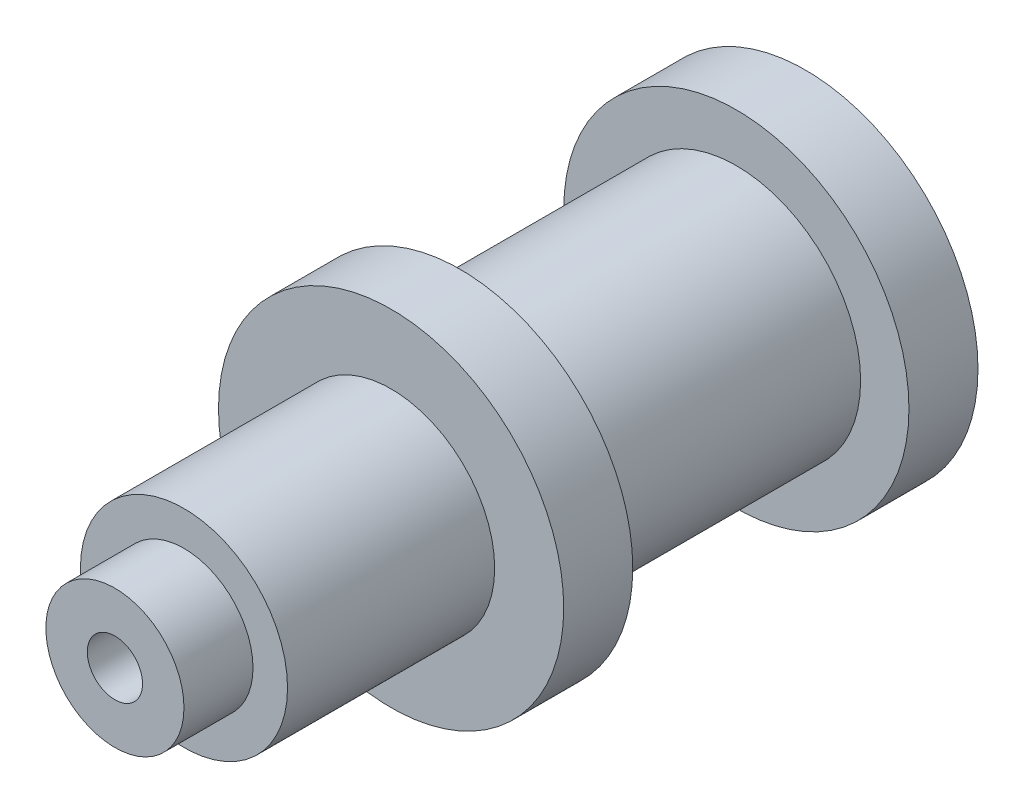
ISO-10303-21;
HEADER;
FILE_DESCRIPTION(('STEP AP214'),'2;1');
FILE_NAME('part.step','',(''),(''),'','','');
FILE_SCHEMA(('AUTOMOTIVE_DESIGN { 1 0 10303 214 1 1 1 1 }'));
ENDSEC;
DATA;
#1=APPLICATION_CONTEXT('core data for automotive mechanical design processes');
#2=APPLICATION_PROTOCOL_DEFINITION('international standard','automotive_design',2000,#1);
#3=PRODUCT_CONTEXT('',#1,'mechanical');
#4=PRODUCT('Part','Part','',(#3));
#5=PRODUCT_RELATED_PRODUCT_CATEGORY('part','',(#4));
#6=PRODUCT_DEFINITION_FORMATION('','',#4);
#7=PRODUCT_DEFINITION_CONTEXT('part definition',#1,'design');
#8=PRODUCT_DEFINITION('design','',#6,#7);
#9=PRODUCT_DEFINITION_SHAPE('','',#8);
#10=(LENGTH_UNIT() NAMED_UNIT(*) SI_UNIT(.MILLI.,.METRE.));
#11=(NAMED_UNIT(*) PLANE_ANGLE_UNIT() SI_UNIT($,.RADIAN.));
#12=(NAMED_UNIT(*) SI_UNIT($,.STERADIAN.) SOLID_ANGLE_UNIT());
#13=UNCERTAINTY_MEASURE_WITH_UNIT(LENGTH_MEASURE(1.E-05),#10,'distance_accuracy_value','');
#14=(GEOMETRIC_REPRESENTATION_CONTEXT(3) GLOBAL_UNCERTAINTY_ASSIGNED_CONTEXT((#13)) GLOBAL_UNIT_ASSIGNED_CONTEXT((#10,
#11,#12)) REPRESENTATION_CONTEXT('',''));
#15=CARTESIAN_POINT('',(0.,0.,0.));
#16=DIRECTION('',(0.,0.,1.));
#17=DIRECTION('',(1.,0.,0.));
#18=AXIS2_PLACEMENT_3D('',#15,#16,#17);
#19=CARTESIAN_POINT('',(0.,0.,60.));
#20=DIRECTION('',(0.,0.,1.));
#21=DIRECTION('',(1.,0.,0.));
#22=AXIS2_PLACEMENT_3D('',#19,#20,#21);
#23=PLANE('',#22);
#24=CARTESIAN_POINT('',(0.,0.,60.));
#25=DIRECTION('',(0.,0.,1.));
#26=DIRECTION('',(1.,0.,0.));
#27=AXIS2_PLACEMENT_3D('',#24,#25,#26);
#28=CIRCLE('',#27,15.);
#29=CARTESIAN_POINT('',(15.,0.,60.));
#30=VERTEX_POINT('',#29);
#31=EDGE_CURVE('E25',#30,#30,#28,.T.);
#32=ORIENTED_EDGE('',*,*,#31,.F.);
#33=EDGE_LOOP('',(#32));
#34=FACE_BOUND('',#33,.T.);
#35=CARTESIAN_POINT('',(0.,0.,60.));
#36=DIRECTION('',(0.,0.,1.));
#37=DIRECTION('',(1.,0.,0.));
#38=AXIS2_PLACEMENT_3D('',#35,#36,#37);
#39=CIRCLE('',#38,25.);
#40=CARTESIAN_POINT('',(25.,0.,60.));
#41=VERTEX_POINT('',#40);
#42=EDGE_CURVE('E45',#41,#41,#39,.T.);
#43=ORIENTED_EDGE('',*,*,#42,.T.);
#44=EDGE_LOOP('',(#43));
#45=FACE_BOUND('',#44,.T.);
#46=ADVANCED_FACE('F16',(#34,#45),#23,.T.);
#47=CARTESIAN_POINT('',(0.,0.,60.));
#48=DIRECTION('',(0.,0.,1.));
#49=DIRECTION('',(1.,0.,0.));
#50=AXIS2_PLACEMENT_3D('',#47,#48,#49);
#51=CYLINDRICAL_SURFACE('',#50,15.);
#52=ORIENTED_EDGE('',*,*,#31,.T.);
#53=DIRECTION('',(0.,0.,1.));
#54=VECTOR('',#53,1.);
#55=CARTESIAN_POINT('',(15.,0.,60.));
#56=LINE('',#55,#54);
#57=CARTESIAN_POINT('',(15.,0.,90.));
#58=VERTEX_POINT('',#57);
#59=EDGE_CURVE('E10',#30,#58,#56,.T.);
#60=ORIENTED_EDGE('',*,*,#59,.T.);
#61=CARTESIAN_POINT('',(0.,0.,90.));
#62=DIRECTION('',(0.,0.,1.));
#63=DIRECTION('',(1.,0.,0.));
#64=AXIS2_PLACEMENT_3D('',#61,#62,#63);
#65=CIRCLE('',#64,15.);
#66=EDGE_CURVE('E256',#58,#58,#65,.T.);
#67=ORIENTED_EDGE('',*,*,#66,.F.);
#68=ORIENTED_EDGE('',*,*,#59,.F.);
#69=EDGE_LOOP('',(#52,#60,#67,#68));
#70=FACE_BOUND('',#69,.T.);
#71=ADVANCED_FACE('F18',(#70),#51,.T.);
#72=CARTESIAN_POINT('',(0.,0.,50.));
#73=DIRECTION('',(0.,0.,1.));
#74=DIRECTION('',(1.,0.,0.));
#75=AXIS2_PLACEMENT_3D('',#72,#73,#74);
#76=CYLINDRICAL_SURFACE('',#75,25.);
#77=CARTESIAN_POINT('',(0.,0.,50.));
#78=DIRECTION('',(0.,0.,1.));
#79=DIRECTION('',(1.,0.,0.));
#80=AXIS2_PLACEMENT_3D('',#77,#78,#79);
#81=CIRCLE('',#80,25.);
#82=CARTESIAN_POINT('',(25.,0.,50.));
#83=VERTEX_POINT('',#82);
#84=EDGE_CURVE('E253',#83,#83,#81,.T.);
#85=ORIENTED_EDGE('',*,*,#84,.T.);
#86=DIRECTION('',(0.,0.,1.));
#87=VECTOR('',#86,1.);
#88=CARTESIAN_POINT('',(25.,0.,50.));
#89=LINE('',#88,#87);
#90=EDGE_CURVE('E92',#83,#41,#89,.T.);
#91=ORIENTED_EDGE('',*,*,#90,.T.);
#92=ORIENTED_EDGE('',*,*,#42,.F.);
#93=ORIENTED_EDGE('',*,*,#90,.F.);
#94=EDGE_LOOP('',(#85,#91,#92,#93));
#95=FACE_BOUND('',#94,.T.);
#96=ADVANCED_FACE('F271',(#95),#76,.T.);
#97=CARTESIAN_POINT('',(0.,0.,90.));
#98=DIRECTION('',(0.,0.,1.));
#99=DIRECTION('',(1.,0.,0.));
#100=AXIS2_PLACEMENT_3D('',#97,#98,#99);
#101=PLANE('',#100);
#102=CARTESIAN_POINT('',(0.,0.,90.));
#103=DIRECTION('',(0.,0.,1.));
#104=DIRECTION('',(1.,0.,0.));
#105=AXIS2_PLACEMENT_3D('',#102,#103,#104);
#106=CIRCLE('',#105,10.);
#107=CARTESIAN_POINT('',(10.,0.,90.));
#108=VERTEX_POINT('',#107);
#109=EDGE_CURVE('E246',#108,#108,#106,.T.);
#110=ORIENTED_EDGE('',*,*,#109,.F.);
#111=EDGE_LOOP('',(#110));
#112=FACE_BOUND('',#111,.T.);
#113=ORIENTED_EDGE('',*,*,#66,.T.);
#114=EDGE_LOOP('',(#113));
#115=FACE_BOUND('',#114,.T.);
#116=ADVANCED_FACE('F276',(#112,#115),#101,.T.);
#117=CARTESIAN_POINT('',(0.,0.,50.));
#118=DIRECTION('',(0.,0.,1.));
#119=DIRECTION('',(1.,0.,0.));
#120=AXIS2_PLACEMENT_3D('',#117,#118,#119);
#121=PLANE('',#120);
#122=ORIENTED_EDGE('',*,*,#84,.F.);
#123=EDGE_LOOP('',(#122));
#124=FACE_BOUND('',#123,.T.);
#125=CARTESIAN_POINT('',(0.,0.,50.));
#126=DIRECTION('',(0.,0.,1.));
#127=DIRECTION('',(1.,0.,0.));
#128=AXIS2_PLACEMENT_3D('',#125,#126,#127);
#129=CIRCLE('',#128,18.);
#130=CARTESIAN_POINT('',(18.,0.,50.));
#131=VERTEX_POINT('',#130);
#132=EDGE_CURVE('E240',#131,#131,#129,.T.);
#133=ORIENTED_EDGE('',*,*,#132,.T.);
#134=EDGE_LOOP('',(#133));
#135=FACE_BOUND('',#134,.T.);
#136=ADVANCED_FACE('F279',(#124,#135),#121,.F.);
#137=CARTESIAN_POINT('',(0.,0.,90.));
#138=DIRECTION('',(0.,0.,1.));
#139=DIRECTION('',(1.,0.,0.));
#140=AXIS2_PLACEMENT_3D('',#137,#138,#139);
#141=CYLINDRICAL_SURFACE('',#140,10.);
#142=ORIENTED_EDGE('',*,*,#109,.T.);
#143=DIRECTION('',(0.,0.,1.));
#144=VECTOR('',#143,1.);
#145=CARTESIAN_POINT('',(10.,0.,90.));
#146=LINE('',#145,#144);
#147=CARTESIAN_POINT('',(10.,0.,100.));
#148=VERTEX_POINT('',#147);
#149=EDGE_CURVE('E82',#108,#148,#146,.T.);
#150=ORIENTED_EDGE('',*,*,#149,.T.);
#151=CARTESIAN_POINT('',(0.,0.,100.));
#152=DIRECTION('',(0.,0.,1.));
#153=DIRECTION('',(1.,0.,0.));
#154=AXIS2_PLACEMENT_3D('',#151,#152,#153);
#155=CIRCLE('',#154,10.);
#156=EDGE_CURVE('E232',#148,#148,#155,.T.);
#157=ORIENTED_EDGE('',*,*,#156,.F.);
#158=ORIENTED_EDGE('',*,*,#149,.F.);
#159=EDGE_LOOP('',(#142,#150,#157,#158));
#160=FACE_BOUND('',#159,.T.);
#161=ADVANCED_FACE('F274',(#160),#141,.T.);
#162=CARTESIAN_POINT('',(0.,0.,10.));
#163=DIRECTION('',(0.,0.,1.));
#164=DIRECTION('',(1.,0.,0.));
#165=AXIS2_PLACEMENT_3D('',#162,#163,#164);
#166=CYLINDRICAL_SURFACE('',#165,18.);
#167=CARTESIAN_POINT('',(0.,0.,10.));
#168=DIRECTION('',(0.,0.,1.));
#169=DIRECTION('',(1.,0.,0.));
#170=AXIS2_PLACEMENT_3D('',#167,#168,#169);
#171=CIRCLE('',#170,18.);
#172=CARTESIAN_POINT('',(18.,0.,10.));
#173=VERTEX_POINT('',#172);
#174=EDGE_CURVE('E134',#173,#173,#171,.T.);
#175=ORIENTED_EDGE('',*,*,#174,.T.);
#176=DIRECTION('',(0.,0.,1.));
#177=VECTOR('',#176,1.);
#178=CARTESIAN_POINT('',(18.,0.,10.));
#179=LINE('',#178,#177);
#180=EDGE_CURVE('E233',#173,#131,#179,.T.);
#181=ORIENTED_EDGE('',*,*,#180,.T.);
#182=ORIENTED_EDGE('',*,*,#132,.F.);
#183=ORIENTED_EDGE('',*,*,#180,.F.);
#184=EDGE_LOOP('',(#175,#181,#182,#183));
#185=FACE_BOUND('',#184,.T.);
#186=ADVANCED_FACE('F290',(#185),#166,.T.);
#187=CARTESIAN_POINT('',(0.,0.,100.));
#188=DIRECTION('',(0.,0.,1.));
#189=DIRECTION('',(1.,0.,0.));
#190=AXIS2_PLACEMENT_3D('',#187,#188,#189);
#191=PLANE('',#190);
#192=CARTESIAN_POINT('',(0.,0.,100.));
#193=DIRECTION('',(0.,0.,-1.));
#194=DIRECTION('',(1.,0.,0.));
#195=AXIS2_PLACEMENT_3D('',#192,#193,#194);
#196=CIRCLE('',#195,4.);
#197=CARTESIAN_POINT('',(4.,0.,100.));
#198=VERTEX_POINT('',#197);
#199=EDGE_CURVE('E152',#198,#198,#196,.T.);
#200=ORIENTED_EDGE('',*,*,#199,.T.);
#201=EDGE_LOOP('',(#200));
#202=FACE_BOUND('',#201,.T.);
#203=ORIENTED_EDGE('',*,*,#156,.T.);
#204=EDGE_LOOP('',(#203));
#205=FACE_BOUND('',#204,.T.);
#206=ADVANCED_FACE('F329',(#202,#205),#191,.T.);
#207=CARTESIAN_POINT('',(1.299,0.,0.375));
#208=CARTESIAN_POINT('',(2.892931773095,0.411152599877,0.3957306991));
#209=CARTESIAN_POINT('',(4.339051681888,1.932754386365,0.448105189563));
#210=CARTESIAN_POINT('',(4.998874652403,4.507757380223,0.531340942699));
#211=CARTESIAN_POINT('',(4.212212200387,7.692851955475,0.647635530179));
#212=CARTESIAN_POINT('',(1.681336378804,10.654971548693,0.79246728603));
#213=CARTESIAN_POINT('',(-2.475743037412,12.40267789219,0.972785491627));
#214=CARTESIAN_POINT('',(-7.416902117072,12.159300956611,1.180541544115));
#215=CARTESIAN_POINT('',(-12.1293018314,9.721468491896,1.422398424597));
#216=CARTESIAN_POINT('',(-15.60111036593,5.436976685875,1.694225449425));
#217=CARTESIAN_POINT('',(-18.7869980561,-5.341230633489,2.300922790337));
#218=CARTESIAN_POINT('',(-18.49621449088,-11.83572343247,2.635088989959));
#219=CARTESIAN_POINT('',(-15.68307156637,-18.69218789534,3.00129012374));
#220=CARTESIAN_POINT('',(-10.00475141449,-24.7896862544,3.397099713738));
#221=CARTESIAN_POINT('',(-1.782733150204,-28.77049148836,3.823895023192));
#222=CARTESIAN_POINT('',(8.041762442298,-29.47028661474,4.283781743196));
#223=CARTESIAN_POINT('',(17.813642650211,-26.31501145167,4.769354402122));
#224=CARTESIAN_POINT('',(25.929757724233,-19.64853201211,5.290138851515));
#225=CARTESIAN_POINT('',(31.09122090286,-10.48873805591,5.837697179465));
#226=CARTESIAN_POINT('',(32.682257866012,-0.249232711201,6.416501843755));
#227=CARTESIAN_POINT('',(-1.299,0.,0.375));
#228=CARTESIAN_POINT('',(0.29493177309,-0.402476515756,0.349526654312));
#229=CARTESIAN_POINT('',(2.025085191258,0.305339224308,0.355822128066));
#230=CARTESIAN_POINT('',(3.253063542986,2.179032461829,0.392723195656));
#231=CARTESIAN_POINT('',(3.267861402046,4.885378102018,0.463074993671));
#232=CARTESIAN_POINT('',(1.671150460134,7.679724856956,0.56182316367));
#233=CARTESIAN_POINT('',(-1.554445644197,9.598304554313,0.6959968613));
#234=CARTESIAN_POINT('',(-5.700090057267,9.833240780175,0.858115058896));
#235=CARTESIAN_POINT('',(-9.851382343361,8.091666229255,1.054052284863));
#236=CARTESIAN_POINT('',(-13.04389531889,4.610982070437,1.280326793184));
#237=CARTESIAN_POINT('',(-16.23032704606,-4.565654436154,1.796103111966));
#238=CARTESIAN_POINT('',(-16.21935636797,-10.26222932034,2.085040983632));
#239=CARTESIAN_POINT('',(-13.9633831341,-16.43420765637,2.405969576249));
#240=CARTESIAN_POINT('',(-9.06732058999,-22.06801820513,2.757118603172));
#241=CARTESIAN_POINT('',(-1.752347185475,-25.88929128016,3.139052836625));
#242=CARTESIAN_POINT('',(7.172514142269,-26.75746897833,3.554493181527));
#243=CARTESIAN_POINT('',(16.180145989125,-24.06533286364,3.996044952312));
#244=CARTESIAN_POINT('',(23.759869637071,-18.06775434624,4.472769986635));
#245=CARTESIAN_POINT('',(28.655602896442,-9.676510676631,4.976825060867));
#246=CARTESIAN_POINT('',(30.247178383028,-0.199612630426,5.512328321065));
#247=(BOUNDED_SURFACE() B_SPLINE_SURFACE(1,10,((#207,#208,#209,#210,#211,#212,#213,#214,#215,
#216,#217,#218,#219,#220,#221,#222,#223,#224,#225,#226),(#227,#228,#229,#230,#231,#232,#233,
#234,#235,#236,#237,#238,#239,#240,#241,#242,#243,#244,#245,#246)),.UNSPECIFIED.,.F.,.F.,
.F.) B_SPLINE_SURFACE_WITH_KNOTS((2,2),(11,9,11),(0.,2.598),(0.,0.5,1.),
.UNSPECIFIED.) GEOMETRIC_REPRESENTATION_ITEM() RATIONAL_B_SPLINE_SURFACE(((1.,1.,1.,1.,1.,1.,1.,
1.,1.,1.,1.,1.,1.,1.,1.,1.,1.,1.,1.,1.),(1.,1.,1.,1.,1.,1.,1.,1.,1.,1.,1.,1.,1.,1.,1.,1.,1.,1.,
1.,1.))) REPRESENTATION_ITEM('') SURFACE());
#248=CARTESIAN_POINT('',(1.299,0.,0.375));
#249=CARTESIAN_POINT('',(2.892931773095,0.411152599877,0.3957306991));
#250=CARTESIAN_POINT('',(4.339051681888,1.932754386365,0.448105189563));
#251=CARTESIAN_POINT('',(4.998874652403,4.507757380223,0.531340942699));
#252=CARTESIAN_POINT('',(4.212212200387,7.692851955475,0.647635530179));
#253=CARTESIAN_POINT('',(1.681336378804,10.654971548693,0.79246728603));
#254=CARTESIAN_POINT('',(-2.475743037412,12.40267789219,0.972785491627));
#255=CARTESIAN_POINT('',(-7.416902117072,12.159300956611,1.180541544115));
#256=CARTESIAN_POINT('',(-12.1293018314,9.721468491896,1.422398424597));
#257=CARTESIAN_POINT('',(-15.60111036593,5.436976685875,1.694225449425));
#258=CARTESIAN_POINT('',(-18.7869980561,-5.341230633489,2.300922790337));
#259=CARTESIAN_POINT('',(-18.49621449088,-11.83572343247,2.635088989959));
#260=CARTESIAN_POINT('',(-15.68307156637,-18.69218789534,3.00129012374));
#261=CARTESIAN_POINT('',(-10.00475141449,-24.7896862544,3.397099713738));
#262=CARTESIAN_POINT('',(-1.782733150204,-28.77049148836,3.823895023192));
#263=CARTESIAN_POINT('',(8.041762442298,-29.47028661474,4.283781743196));
#264=CARTESIAN_POINT('',(17.813642650211,-26.31501145167,4.769354402122));
#265=CARTESIAN_POINT('',(25.929757724233,-19.64853201211,5.290138851515));
#266=CARTESIAN_POINT('',(31.09122090286,-10.48873805591,5.837697179465));
#267=CARTESIAN_POINT('',(32.682257866012,-0.249232711201,6.416501843755));
#268=(BOUNDED_CURVE() B_SPLINE_CURVE(10,(#248,#249,#250,#251,#252,#253,#254,#255,#256,#257,#258,
#259,#260,#261,#262,#263,#264,#265,#266,#267),.UNSPECIFIED.,.F.,
.F.) B_SPLINE_CURVE_WITH_KNOTS((11,9,11),(0.,0.5,1.),
.UNSPECIFIED.) CURVE() GEOMETRIC_REPRESENTATION_ITEM() RATIONAL_B_SPLINE_CURVE((1.,1.,1.,1.,1.,
1.,1.,1.,1.,1.,1.,1.,1.,1.,1.,1.,1.,1.,1.,1.)) REPRESENTATION_ITEM(''));
#269=CARTESIAN_POINT('',(3.444794751082,2.033073811478,0.450868597613));
#270=VERTEX_POINT('',#269);
#271=CARTESIAN_POINT('',(-0.234510128568,-24.99890007579,3.856892967297));
#272=VERTEX_POINT('',#271);
#273=EDGE_CURVE('E107',#270,#272,#268,.T.);
#274=CARTESIAN_POINT('',(2.003777417636,3.46191797427,0.44696259329));
#275=CARTESIAN_POINT('',(2.114705908061,3.39771194578,0.449561716193));
#276=CARTESIAN_POINT('',(2.222905434678,3.328758501729,0.451768600507));
#277=CARTESIAN_POINT('',(2.328067848059,3.255232405279,0.453583100443));
#278=CARTESIAN_POINT('',(2.531756474952,3.099459369269,0.456427216072));
#279=CARTESIAN_POINT('',(2.63028262451,3.017211933922,0.457456800779));
#280=CARTESIAN_POINT('',(2.72520555052,2.930819005488,0.45809379778));
#281=CARTESIAN_POINT('',(2.907344765829,2.750235204238,0.458582573346));
#282=CARTESIAN_POINT('',(2.994560781069,2.656043696785,0.458434305625));
#283=CARTESIAN_POINT('',(3.077667767394,2.558204493077,0.457893346206));
#284=CARTESIAN_POINT('',(3.235234109731,2.35578267519,0.456026009212));
#285=CARTESIAN_POINT('',(3.309692918545,2.251199322691,0.454699568038));
#286=CARTESIAN_POINT('',(3.379606260899,2.143527729848,0.452980410684));
#287=CARTESIAN_POINT('',(3.444794751082,2.033073811478,0.450868597613));
#288=(BOUNDED_CURVE() B_SPLINE_CURVE(4,(#274,#275,#276,#277,#278,#279,#280,#281,#282,#283,#284,
#285,#286,#287),.UNSPECIFIED.,.F.,.F.) B_SPLINE_CURVE_WITH_KNOTS((5,3,3,3,5),(0.,0.249980157508,
0.499970296045,0.749975107285,1.),
.UNSPECIFIED.) CURVE() GEOMETRIC_REPRESENTATION_ITEM() RATIONAL_B_SPLINE_CURVE((1.,1.,1.,1.,1.,
1.,1.,1.,1.,1.,1.,1.,1.,1.)) REPRESENTATION_ITEM(''));
#289=CARTESIAN_POINT('',(2.003777417636,3.46191797427,0.44696259329));
#290=VERTEX_POINT('',#289);
#291=EDGE_CURVE('E146',#290,#270,#288,.T.);
#292=CARTESIAN_POINT('',(-1.299,0.,0.375));
#293=CARTESIAN_POINT('',(0.29493177309,-0.402476515756,0.349526654312));
#294=CARTESIAN_POINT('',(2.025085191258,0.305339224308,0.355822128066));
#295=CARTESIAN_POINT('',(3.253063542986,2.179032461829,0.392723195656));
#296=CARTESIAN_POINT('',(3.267861402046,4.885378102018,0.463074993671));
#297=CARTESIAN_POINT('',(1.671150460134,7.679724856956,0.56182316367));
#298=CARTESIAN_POINT('',(-1.554445644197,9.598304554313,0.6959968613));
#299=CARTESIAN_POINT('',(-5.700090057267,9.833240780175,0.858115058896));
#300=CARTESIAN_POINT('',(-9.851382343361,8.091666229255,1.054052284863));
#301=CARTESIAN_POINT('',(-13.04389531889,4.610982070437,1.280326793184));
#302=CARTESIAN_POINT('',(-16.23032704606,-4.565654436154,1.796103111966));
#303=CARTESIAN_POINT('',(-16.21935636797,-10.26222932034,2.085040983632));
#304=CARTESIAN_POINT('',(-13.9633831341,-16.43420765637,2.405969576249));
#305=CARTESIAN_POINT('',(-9.06732058999,-22.06801820513,2.757118603172));
#306=CARTESIAN_POINT('',(-1.752347185475,-25.88929128016,3.139052836625));
#307=CARTESIAN_POINT('',(7.172514142269,-26.75746897833,3.554493181527));
#308=CARTESIAN_POINT('',(16.180145989125,-24.06533286364,3.996044952312));
#309=CARTESIAN_POINT('',(23.759869637071,-18.06775434624,4.472769986635));
#310=CARTESIAN_POINT('',(28.655602896442,-9.676510676631,4.976825060867));
#311=CARTESIAN_POINT('',(30.247178383028,-0.199612630426,5.512328321065));
#312=(BOUNDED_CURVE() B_SPLINE_CURVE(10,(#292,#293,#294,#295,#296,#297,#298,#299,#300,#301,#302,
#303,#304,#305,#306,#307,#308,#309,#310,#311),.UNSPECIFIED.,.F.,
.F.) B_SPLINE_CURVE_WITH_KNOTS((11,9,11),(0.,0.5,1.),
.UNSPECIFIED.) CURVE() GEOMETRIC_REPRESENTATION_ITEM() RATIONAL_B_SPLINE_CURVE((1.,1.,1.,1.,1.,
1.,1.,1.,1.,1.,1.,1.,1.,1.,1.,1.,1.,1.,1.,1.)) REPRESENTATION_ITEM(''));
#313=CARTESIAN_POINT('',(11.901133517175,-21.98551843842,3.848086116951));
#314=VERTEX_POINT('',#313);
#315=EDGE_CURVE('E139',#290,#314,#312,.T.);
#316=CARTESIAN_POINT('',(11.901133517175,-21.98551843842,3.848086116951));
#317=CARTESIAN_POINT('',(11.208992277155,-22.360186215,3.851085725068));
#318=CARTESIAN_POINT('',(10.501096782861,-22.70581574115,3.853674891557));
#319=CARTESIAN_POINT('',(9.779277905743,-23.02140951542,3.855854890986));
#320=CARTESIAN_POINT('',(8.309963357747,-23.59167184479,3.859403137382));
#321=CARTESIAN_POINT('',(7.562410092294,-23.84619691162,3.860769478748));
#322=CARTESIAN_POINT('',(6.804774304263,-24.06901834865,3.861727197245));
#323=CARTESIAN_POINT('',(5.271693827403,-24.45065725416,3.862829096867));
#324=CARTESIAN_POINT('',(4.496211360675,-24.60933033366,3.862971448026));
#325=CARTESIAN_POINT('',(3.714697378013,-24.73512754509,3.862705829943));
#326=CARTESIAN_POINT('',(2.142118027352,-24.92066482801,3.861359762147));
#327=CARTESIAN_POINT('',(1.351034053811,-24.98026243438,3.860277559636));
#328=CARTESIAN_POINT('',(0.558114724247,-25.00633554517,3.85878819821));
#329=CARTESIAN_POINT('',(-0.234510128568,-24.99890007579,3.856892967297));
#330=(BOUNDED_CURVE() B_SPLINE_CURVE(4,(#316,#317,#318,#319,#320,#321,#322,#323,#324,#325,#326,
#327,#328,#329),.UNSPECIFIED.,.F.,.F.) B_SPLINE_CURVE_WITH_KNOTS((5,3,3,3,5),(0.,0.24914845112,
0.498879109945,0.74917036796,1.),
.UNSPECIFIED.) CURVE() GEOMETRIC_REPRESENTATION_ITEM() RATIONAL_B_SPLINE_CURVE((1.,1.,1.,1.,1.,
1.,1.,1.,1.,1.,1.,1.,1.,1.)) REPRESENTATION_ITEM(''));
#331=EDGE_CURVE('E173',#314,#272,#330,.T.);
#332=ORIENTED_EDGE('',*,*,#273,.F.);
#333=ORIENTED_EDGE('',*,*,#291,.F.);
#334=ORIENTED_EDGE('',*,*,#315,.T.);
#335=ORIENTED_EDGE('',*,*,#331,.T.);
#336=EDGE_LOOP('',(#332,#333,#334,#335));
#337=FACE_BOUND('',#336,.T.);
#338=ADVANCED_FACE('F312',(#337),#247,.T.);
#339=CARTESIAN_POINT('',(-1.299,0.,0.375));
#340=CARTESIAN_POINT('',(0.29493177309,-0.402476515756,0.349526654312));
#341=CARTESIAN_POINT('',(2.025085191258,0.305339224308,0.355822128066));
#342=CARTESIAN_POINT('',(3.253063542986,2.179032461829,0.392723195656));
#343=CARTESIAN_POINT('',(3.267861402046,4.885378102018,0.463074993671));
#344=CARTESIAN_POINT('',(1.671150460134,7.679724856956,0.56182316367));
#345=CARTESIAN_POINT('',(-1.554445644197,9.598304554313,0.6959968613));
#346=CARTESIAN_POINT('',(-5.700090057267,9.833240780175,0.858115058896));
#347=CARTESIAN_POINT('',(-9.851382343361,8.091666229255,1.054052284863));
#348=CARTESIAN_POINT('',(-13.04389531889,4.610982070437,1.280326793184));
#349=CARTESIAN_POINT('',(-16.23032704606,-4.565654436154,1.796103111966));
#350=CARTESIAN_POINT('',(-16.21935636797,-10.26222932034,2.085040983632));
#351=CARTESIAN_POINT('',(-13.9633831341,-16.43420765637,2.405969576249));
#352=CARTESIAN_POINT('',(-9.06732058999,-22.06801820513,2.757118603172));
#353=CARTESIAN_POINT('',(-1.752347185475,-25.88929128016,3.139052836625));
#354=CARTESIAN_POINT('',(7.172514142269,-26.75746897833,3.554493181527));
#355=CARTESIAN_POINT('',(16.180145989125,-24.06533286364,3.996044952312));
#356=CARTESIAN_POINT('',(23.759869637071,-18.06775434624,4.472769986635));
#357=CARTESIAN_POINT('',(28.655602896442,-9.676510676631,4.976825060867));
#358=CARTESIAN_POINT('',(30.247178383028,-0.199612630426,5.512328321065));
#359=CARTESIAN_POINT('',(0.,0.,0.));
#360=CARTESIAN_POINT('',(1.60060094814,0.00433827391351,-0.002371323293353));
#361=CARTESIAN_POINT('',(3.195388578587,1.123694342933,0.02709544516924));
#362=CARTESIAN_POINT('',(4.14325034024,3.357328122599,0.0874260249883));
#363=CARTESIAN_POINT('',(3.755724182947,6.315361353253,0.181147782706));
#364=CARTESIAN_POINT('',(1.683328429136,9.205612725125,0.303456404929));
#365=CARTESIAN_POINT('',(-2.023402982911,11.046428575373,0.461369794101));
#366=CARTESIAN_POINT('',(-6.585752019329,11.042205926368,0.647086669483));
#367=CARTESIAN_POINT('',(-11.03608028884,8.943815335818,0.866907539231));
#368=CARTESIAN_POINT('',(-14.3821438724,5.045068940646,1.117005716133));
#369=CARTESIAN_POINT('',(-17.58163098153,-4.973883706307,1.680600241783));
#370=CARTESIAN_POINT('',(-17.43015821696,-11.09479388186,1.99345892791));
#371=CARTESIAN_POINT('',(-14.88508390155,-17.63613251207,2.338464696256));
#372=CARTESIAN_POINT('',(-9.575926058985,-23.52621161631,2.713505787073));
#373=CARTESIAN_POINT('',(-1.775148562427,-27.44349087288,3.119562973661));
#374=CARTESIAN_POINT('',(7.638479807777,-28.23077790987,3.559055340994));
#375=CARTESIAN_POINT('',(17.067241872546,-25.29496062982,4.024551772243));
#376=CARTESIAN_POINT('',(24.947763436247,-18.93668611123,4.525388249496));
#377=CARTESIAN_POINT('',(29.997267527166,-10.12478333916,5.053385977345));
#378=CARTESIAN_POINT('',(31.595228159551,-0.22570934201,5.612860712172));
#379=(BOUNDED_SURFACE() B_SPLINE_SURFACE(1,10,((#339,#340,#341,#342,#343,#344,#345,#346,#347,
#348,#349,#350,#351,#352,#353,#354,#355,#356,#357,#358),(#359,#360,#361,#362,#363,#364,#365,
#366,#367,#368,#369,#370,#371,#372,#373,#374,#375,#376,#377,#378)),.UNSPECIFIED.,.F.,.F.,
.F.) B_SPLINE_SURFACE_WITH_KNOTS((2,2),(11,9,11),(0.,1.35204511759),(0.,0.5,1.),
.UNSPECIFIED.) GEOMETRIC_REPRESENTATION_ITEM() RATIONAL_B_SPLINE_SURFACE(((1.,1.,1.,1.,1.,1.,1.,
1.,1.,1.,1.,1.,1.,1.,1.,1.,1.,1.,1.,1.),(1.,1.,1.,1.,1.,1.,1.,1.,1.,1.,1.,1.,1.,1.,1.,1.,1.,1.,
1.,1.))) REPRESENTATION_ITEM('') SURFACE());
#380=CARTESIAN_POINT('',(2.825589682519,2.831261723338,0.08299158858394));
#381=CARTESIAN_POINT('',(2.679214879915,2.977343284294,0.157614830163));
#382=CARTESIAN_POINT('',(2.523052035812,3.114312337438,0.231329277169));
#383=CARTESIAN_POINT('',(2.357833456487,3.241258980849,0.304128399738));
#384=CARTESIAN_POINT('',(2.184418056445,3.357362165772,0.376008257053));
#385=CARTESIAN_POINT('',(2.003777417636,3.46191797427,0.44696259329));
#386=(BOUNDED_CURVE() B_SPLINE_CURVE(5,(#380,#381,#382,#383,#384,#385),.UNSPECIFIED.,.F.,
.F.) B_SPLINE_CURVE_WITH_KNOTS((6,6),(0.,1.),
.UNSPECIFIED.) CURVE() GEOMETRIC_REPRESENTATION_ITEM() RATIONAL_B_SPLINE_CURVE((1.,1.,1.,1.,1.,1.)) REPRESENTATION_ITEM(''));
#387=CARTESIAN_POINT('',(2.825589682519,2.831261723338,0.08299158858394));
#388=VERTEX_POINT('',#387);
#389=EDGE_CURVE('E137',#388,#290,#386,.T.);
#390=CARTESIAN_POINT('',(0.,0.,0.));
#391=CARTESIAN_POINT('',(1.60060094814,0.00433827391351,-0.002371323293353));
#392=CARTESIAN_POINT('',(3.195388578587,1.123694342933,0.02709544516924));
#393=CARTESIAN_POINT('',(4.14325034024,3.357328122599,0.0874260249883));
#394=CARTESIAN_POINT('',(3.755724182947,6.315361353253,0.181147782706));
#395=CARTESIAN_POINT('',(1.683328429136,9.205612725125,0.303456404929));
#396=CARTESIAN_POINT('',(-2.023402982911,11.046428575373,0.461369794101));
#397=CARTESIAN_POINT('',(-6.585752019329,11.042205926368,0.647086669483));
#398=CARTESIAN_POINT('',(-11.03608028884,8.943815335818,0.866907539231));
#399=CARTESIAN_POINT('',(-14.3821438724,5.045068940646,1.117005716133));
#400=CARTESIAN_POINT('',(-17.58163098153,-4.973883706307,1.680600241783));
#401=CARTESIAN_POINT('',(-17.43015821696,-11.09479388186,1.99345892791));
#402=CARTESIAN_POINT('',(-14.88508390155,-17.63613251207,2.338464696256));
#403=CARTESIAN_POINT('',(-9.575926058985,-23.52621161631,2.713505787073));
#404=CARTESIAN_POINT('',(-1.775148562427,-27.44349087288,3.119562973661));
#405=CARTESIAN_POINT('',(7.638479807777,-28.23077790987,3.559055340994));
#406=CARTESIAN_POINT('',(17.067241872546,-25.29496062982,4.024551772243));
#407=CARTESIAN_POINT('',(24.947763436247,-18.93668611123,4.525388249496));
#408=CARTESIAN_POINT('',(29.997267527166,-10.12478333916,5.053385977345));
#409=CARTESIAN_POINT('',(31.595228159551,-0.22570934201,5.612860712172));
#410=(BOUNDED_CURVE() B_SPLINE_CURVE(10,(#390,#391,#392,#393,#394,#395,#396,#397,#398,#399,#400,
#401,#402,#403,#404,#405,#406,#407,#408,#409),.UNSPECIFIED.,.F.,
.F.) B_SPLINE_CURVE_WITH_KNOTS((11,9,11),(0.,0.5,1.),
.UNSPECIFIED.) CURVE() GEOMETRIC_REPRESENTATION_ITEM() RATIONAL_B_SPLINE_CURVE((1.,1.,1.,1.,1.,
1.,1.,1.,1.,1.,1.,1.,1.,1.,1.,1.,1.,1.,1.,1.)) REPRESENTATION_ITEM(''));
#411=CARTESIAN_POINT('',(5.53033359107,-24.38063597143,3.472431978039));
#412=VERTEX_POINT('',#411);
#413=EDGE_CURVE('E117',#388,#412,#410,.T.);
#414=CARTESIAN_POINT('',(5.53033359107,-24.38063597143,3.472431978039));
#415=CARTESIAN_POINT('',(5.945874403779,-24.28637758876,3.496530448644));
#416=CARTESIAN_POINT('',(6.359289713376,-24.18267221391,3.520520784534));
#417=CARTESIAN_POINT('',(6.770256912663,-24.06959125069,3.544403063127));
#418=CARTESIAN_POINT('',(7.586995028374,-23.82476454227,3.591971124666));
#419=CARTESIAN_POINT('',(7.992761489317,-23.693003574,3.615656732127));
#420=CARTESIAN_POINT('',(8.395440415382,-23.55203858216,3.639234265818));
#421=CARTESIAN_POINT('',(9.194318456949,-23.25181150442,3.68619197892));
#422=CARTESIAN_POINT('',(9.59051224665,-23.09253495617,3.70957198812));
#423=CARTESIAN_POINT('',(9.982990727614,-22.92427027408,3.732843915586));
#424=CARTESIAN_POINT('',(10.760209544048,-22.56990124928,3.779189578075));
#425=CARTESIAN_POINT('',(11.144943768779,-22.38378325982,3.802263148254));
#426=CARTESIAN_POINT('',(11.525349700448,-22.18893658337,3.82522863468));
#427=CARTESIAN_POINT('',(11.901133517175,-21.98551843842,3.848086116951));
#428=(BOUNDED_CURVE() B_SPLINE_CURVE(4,(#414,#415,#416,#417,#418,#419,#420,#421,#422,#423,#424,
#425,#426,#427),.UNSPECIFIED.,.F.,.F.) B_SPLINE_CURVE_WITH_KNOTS((5,3,3,3,5),(0.,0.249699446836,
0.499603281741,0.749705501841,1.),
.UNSPECIFIED.) CURVE() GEOMETRIC_REPRESENTATION_ITEM() RATIONAL_B_SPLINE_CURVE((1.,1.,1.,1.,1.,
1.,1.,1.,1.,1.,1.,1.,1.,1.)) REPRESENTATION_ITEM(''));
#429=EDGE_CURVE('E168',#412,#314,#428,.T.);
#430=ORIENTED_EDGE('',*,*,#315,.F.);
#431=ORIENTED_EDGE('',*,*,#389,.F.);
#432=ORIENTED_EDGE('',*,*,#413,.T.);
#433=ORIENTED_EDGE('',*,*,#429,.T.);
#434=EDGE_LOOP('',(#430,#431,#432,#433));
#435=FACE_BOUND('',#434,.T.);
#436=ADVANCED_FACE('F138',(#435),#379,.T.);
#437=CARTESIAN_POINT('',(0.,0.,0.));
#438=CARTESIAN_POINT('',(1.60060094814,0.00433827391351,-0.002371323293353));
#439=CARTESIAN_POINT('',(3.195388578587,1.123694342933,0.02709544516924));
#440=CARTESIAN_POINT('',(4.14325034024,3.357328122599,0.0874260249883));
#441=CARTESIAN_POINT('',(3.755724182947,6.315361353253,0.181147782706));
#442=CARTESIAN_POINT('',(1.683328429136,9.205612725125,0.303456404929));
#443=CARTESIAN_POINT('',(-2.023402982911,11.046428575373,0.461369794101));
#444=CARTESIAN_POINT('',(-6.585752019329,11.042205926368,0.647086669483));
#445=CARTESIAN_POINT('',(-11.03608028884,8.943815335818,0.866907539231));
#446=CARTESIAN_POINT('',(-14.3821438724,5.045068940646,1.117005716133));
#447=CARTESIAN_POINT('',(-17.58163098153,-4.973883706307,1.680600241783));
#448=CARTESIAN_POINT('',(-17.43015821696,-11.09479388186,1.99345892791));
#449=CARTESIAN_POINT('',(-14.88508390155,-17.63613251207,2.338464696256));
#450=CARTESIAN_POINT('',(-9.575926058985,-23.52621161631,2.713505787073));
#451=CARTESIAN_POINT('',(-1.775148562427,-27.44349087288,3.119562973661));
#452=CARTESIAN_POINT('',(7.638479807777,-28.23077790987,3.559055340994));
#453=CARTESIAN_POINT('',(17.067241872546,-25.29496062982,4.024551772243));
#454=CARTESIAN_POINT('',(24.947763436247,-18.93668611123,4.525388249496));
#455=CARTESIAN_POINT('',(29.997267527166,-10.12478333916,5.053385977345));
#456=CARTESIAN_POINT('',(31.595228159551,-0.22570934201,5.612860712172));
#457=CARTESIAN_POINT('',(1.299,0.,0.375));
#458=CARTESIAN_POINT('',(2.892931773095,0.411152599877,0.3957306991));
#459=CARTESIAN_POINT('',(4.339051681888,1.932754386365,0.448105189563));
#460=CARTESIAN_POINT('',(4.998874652403,4.507757380223,0.531340942699));
#461=CARTESIAN_POINT('',(4.212212200387,7.692851955475,0.647635530179));
#462=CARTESIAN_POINT('',(1.681336378804,10.654971548693,0.79246728603));
#463=CARTESIAN_POINT('',(-2.475743037412,12.40267789219,0.972785491627));
#464=CARTESIAN_POINT('',(-7.416902117072,12.159300956611,1.180541544115));
#465=CARTESIAN_POINT('',(-12.1293018314,9.721468491896,1.422398424597));
#466=CARTESIAN_POINT('',(-15.60111036593,5.436976685875,1.694225449425));
#467=CARTESIAN_POINT('',(-18.7869980561,-5.341230633489,2.300922790337));
#468=CARTESIAN_POINT('',(-18.49621449088,-11.83572343247,2.635088989959));
#469=CARTESIAN_POINT('',(-15.68307156637,-18.69218789534,3.00129012374));
#470=CARTESIAN_POINT('',(-10.00475141449,-24.7896862544,3.397099713738));
#471=CARTESIAN_POINT('',(-1.782733150204,-28.77049148836,3.823895023192));
#472=CARTESIAN_POINT('',(8.041762442298,-29.47028661474,4.283781743196));
#473=CARTESIAN_POINT('',(17.813642650211,-26.31501145167,4.769354402122));
#474=CARTESIAN_POINT('',(25.929757724233,-19.64853201211,5.290138851515));
#475=CARTESIAN_POINT('',(31.09122090286,-10.48873805591,5.837697179465));
#476=CARTESIAN_POINT('',(32.682257866012,-0.249232711201,6.416501843755));
#477=(BOUNDED_SURFACE() B_SPLINE_SURFACE(1,10,((#437,#438,#439,#440,#441,#442,#443,#444,#445,
#446,#447,#448,#449,#450,#451,#452,#453,#454,#455,#456),(#457,#458,#459,#460,#461,#462,#463,
#464,#465,#466,#467,#468,#469,#470,#471,#472,#473,#474,#475,#476)),.UNSPECIFIED.,.F.,.F.,
.F.) B_SPLINE_SURFACE_WITH_KNOTS((2,2),(11,9,11),(0.,1.35204511759),(0.,0.5,1.),
.UNSPECIFIED.) GEOMETRIC_REPRESENTATION_ITEM() RATIONAL_B_SPLINE_SURFACE(((1.,1.,1.,1.,1.,1.,1.,
1.,1.,1.,1.,1.,1.,1.,1.,1.,1.,1.,1.,1.),(1.,1.,1.,1.,1.,1.,1.,1.,1.,1.,1.,1.,1.,1.,1.,1.,1.,1.,
1.,1.))) REPRESENTATION_ITEM('') SURFACE());
#478=CARTESIAN_POINT('',(3.444794751082,2.033073811478,0.450868597613));
#479=CARTESIAN_POINT('',(3.341320388089,2.208398455619,0.37913283334));
#480=CARTESIAN_POINT('',(3.226943116313,2.376714533829,0.306470942954));
#481=CARTESIAN_POINT('',(3.102333453762,2.537133743223,0.232889885719));
#482=CARTESIAN_POINT('',(2.968265102417,2.688872133888,0.158394464965));
#483=CARTESIAN_POINT('',(2.825589682519,2.831261723338,0.08299158858394));
#484=(BOUNDED_CURVE() B_SPLINE_CURVE(5,(#478,#479,#480,#481,#482,#483),.UNSPECIFIED.,.F.,
.F.) B_SPLINE_CURVE_WITH_KNOTS((6,6),(0.,1.),
.UNSPECIFIED.) CURVE() GEOMETRIC_REPRESENTATION_ITEM() RATIONAL_B_SPLINE_CURVE((1.,1.,1.,1.,1.,1.)) REPRESENTATION_ITEM(''));
#485=EDGE_CURVE('E129',#270,#388,#484,.T.);
#486=CARTESIAN_POINT('',(-0.234510128568,-24.99890007579,3.856892967297));
#487=CARTESIAN_POINT('',(0.131934507152,-25.00233762618,3.833413188402));
#488=CARTESIAN_POINT('',(0.498411278277,-24.99861284269,3.80980818538));
#489=CARTESIAN_POINT('',(0.864709787777,-24.98772684062,3.786077547539));
#490=CARTESIAN_POINT('',(1.594003998818,-24.95178389902,3.738528913348));
#491=CARTESIAN_POINT('',(1.957005075961,-24.92682532964,3.714712651081));
#492=CARTESIAN_POINT('',(2.319418004667,-24.8948306085,3.690771671221));
#493=CARTESIAN_POINT('',(3.0415951808,-24.81693398268,3.64271027891));
#494=CARTESIAN_POINT('',(3.401364117956,-24.77107327079,3.618590600997));
#495=CARTESIAN_POINT('',(3.760143044971,-24.71826772957,3.59434613394));
#496=CARTESIAN_POINT('',(4.472838558688,-24.59925471674,3.545775934067));
#497=CARTESIAN_POINT('',(4.826771642569,-24.53314278515,3.521451932044));
#498=CARTESIAN_POINT('',(5.179334548188,-24.46025414872,3.497004077618));
#499=CARTESIAN_POINT('',(5.53033359107,-24.38063597143,3.472431978039));
#500=(BOUNDED_CURVE() B_SPLINE_CURVE(4,(#486,#487,#488,#489,#490,#491,#492,#493,#494,#495,#496,
#497,#498,#499),.UNSPECIFIED.,.F.,.F.) B_SPLINE_CURVE_WITH_KNOTS((5,3,3,3,5),(0.,0.252107067126,
0.502473271056,0.752102795951,1.),
.UNSPECIFIED.) CURVE() GEOMETRIC_REPRESENTATION_ITEM() RATIONAL_B_SPLINE_CURVE((1.,1.,1.,1.,1.,
1.,1.,1.,1.,1.,1.,1.,1.,1.)) REPRESENTATION_ITEM(''));
#501=EDGE_CURVE('E132',#272,#412,#500,.T.);
#502=ORIENTED_EDGE('',*,*,#413,.F.);
#503=ORIENTED_EDGE('',*,*,#485,.F.);
#504=ORIENTED_EDGE('',*,*,#273,.T.);
#505=ORIENTED_EDGE('',*,*,#501,.T.);
#506=EDGE_LOOP('',(#502,#503,#504,#505));
#507=FACE_BOUND('',#506,.T.);
#508=ADVANCED_FACE('F127',(#507),#477,.T.);
#509=CARTESIAN_POINT('',(0.,0.,10.));
#510=DIRECTION('',(0.,0.,1.));
#511=DIRECTION('',(1.,0.,0.));
#512=AXIS2_PLACEMENT_3D('',#509,#510,#511);
#513=PLANE('',#512);
#514=ORIENTED_EDGE('',*,*,#174,.F.);
#515=EDGE_LOOP('',(#514));
#516=FACE_BOUND('',#515,.T.);
#517=CARTESIAN_POINT('',(0.,0.,10.));
#518=DIRECTION('',(0.,0.,1.));
#519=DIRECTION('',(1.,0.,0.));
#520=AXIS2_PLACEMENT_3D('',#517,#518,#519);
#521=CIRCLE('',#520,25.);
#522=CARTESIAN_POINT('',(25.,0.,10.));
#523=VERTEX_POINT('',#522);
#524=EDGE_CURVE('E186',#523,#523,#521,.T.);
#525=ORIENTED_EDGE('',*,*,#524,.T.);
#526=EDGE_LOOP('',(#525));
#527=FACE_BOUND('',#526,.T.);
#528=ADVANCED_FACE('F293',(#516,#527),#513,.T.);
#529=CARTESIAN_POINT('',(0.,0.,0.));
#530=DIRECTION('',(0.,0.,-1.));
#531=DIRECTION('',(1.,0.,0.));
#532=AXIS2_PLACEMENT_3D('',#529,#530,#531);
#533=CYLINDRICAL_SURFACE('',#532,4.);
#534=ORIENTED_EDGE('',*,*,#291,.T.);
#535=ORIENTED_EDGE('',*,*,#485,.T.);
#536=ORIENTED_EDGE('',*,*,#389,.T.);
#537=EDGE_LOOP('',(#534,#535,#536));
#538=FACE_BOUND('',#537,.T.);
#539=DIRECTION('',(0.,0.,1.));
#540=VECTOR('',#539,1.);
#541=CARTESIAN_POINT('',(4.,0.,0.));
#542=LINE('',#541,#540);
#543=CARTESIAN_POINT('',(4.,0.,0.));
#544=VERTEX_POINT('',#543);
#545=EDGE_CURVE('E172',#544,#198,#542,.T.);
#546=ORIENTED_EDGE('',*,*,#545,.F.);
#547=CARTESIAN_POINT('',(0.,0.,0.));
#548=DIRECTION('',(0.,0.,1.));
#549=DIRECTION('',(1.,0.,0.));
#550=AXIS2_PLACEMENT_3D('',#547,#548,#549);
#551=CIRCLE('',#550,4.);
#552=EDGE_CURVE('E163',#544,#544,#551,.T.);
#553=ORIENTED_EDGE('',*,*,#552,.F.);
#554=ORIENTED_EDGE('',*,*,#545,.T.);
#555=ORIENTED_EDGE('',*,*,#199,.F.);
#556=EDGE_LOOP('',(#546,#553,#554,#555));
#557=FACE_BOUND('',#556,.T.);
#558=ADVANCED_FACE('F144',(#538,#557),#533,.F.);
#559=CARTESIAN_POINT('',(0.,0.,0.));
#560=DIRECTION('',(0.,0.,1.));
#561=DIRECTION('',(1.,0.,0.));
#562=AXIS2_PLACEMENT_3D('',#559,#560,#561);
#563=CYLINDRICAL_SURFACE('',#562,25.);
#564=ORIENTED_EDGE('',*,*,#501,.F.);
#565=ORIENTED_EDGE('',*,*,#331,.F.);
#566=ORIENTED_EDGE('',*,*,#429,.F.);
#567=EDGE_LOOP('',(#564,#565,#566));
#568=FACE_BOUND('',#567,.T.);
#569=DIRECTION('',(0.,0.,1.));
#570=VECTOR('',#569,1.);
#571=CARTESIAN_POINT('',(25.,0.,0.));
#572=LINE('',#571,#570);
#573=CARTESIAN_POINT('',(25.,0.,0.));
#574=VERTEX_POINT('',#573);
#575=EDGE_CURVE('E167',#574,#523,#572,.T.);
#576=ORIENTED_EDGE('',*,*,#575,.F.);
#577=CARTESIAN_POINT('',(0.,0.,0.));
#578=DIRECTION('',(0.,0.,1.));
#579=DIRECTION('',(1.,0.,0.));
#580=AXIS2_PLACEMENT_3D('',#577,#578,#579);
#581=CIRCLE('',#580,25.);
#582=EDGE_CURVE('E157',#574,#574,#581,.T.);
#583=ORIENTED_EDGE('',*,*,#582,.T.);
#584=ORIENTED_EDGE('',*,*,#575,.T.);
#585=ORIENTED_EDGE('',*,*,#524,.F.);
#586=EDGE_LOOP('',(#576,#583,#584,#585));
#587=FACE_BOUND('',#586,.T.);
#588=ADVANCED_FACE('F299',(#568,#587),#563,.T.);
#589=CARTESIAN_POINT('',(0.,0.,0.));
#590=DIRECTION('',(0.,0.,1.));
#591=DIRECTION('',(1.,0.,0.));
#592=AXIS2_PLACEMENT_3D('',#589,#590,#591);
#593=PLANE('',#592);
#594=ORIENTED_EDGE('',*,*,#552,.T.);
#595=EDGE_LOOP('',(#594));
#596=FACE_BOUND('',#595,.T.);
#597=ORIENTED_EDGE('',*,*,#582,.F.);
#598=EDGE_LOOP('',(#597));
#599=FACE_BOUND('',#598,.T.);
#600=ADVANCED_FACE('F302',(#596,#599),#593,.F.);
#601=CLOSED_SHELL('',(#46,#71,#96,#116,#136,#161,#186,#206,#338,#436,#508,#528,#558,#588,#600));
#602=MANIFOLD_SOLID_BREP('B1',#601);
#603=ADVANCED_BREP_SHAPE_REPRESENTATION('',(#18,#602),#14);
#604=SHAPE_DEFINITION_REPRESENTATION(#9,#603);
ENDSEC;
END-ISO-10303-21;
